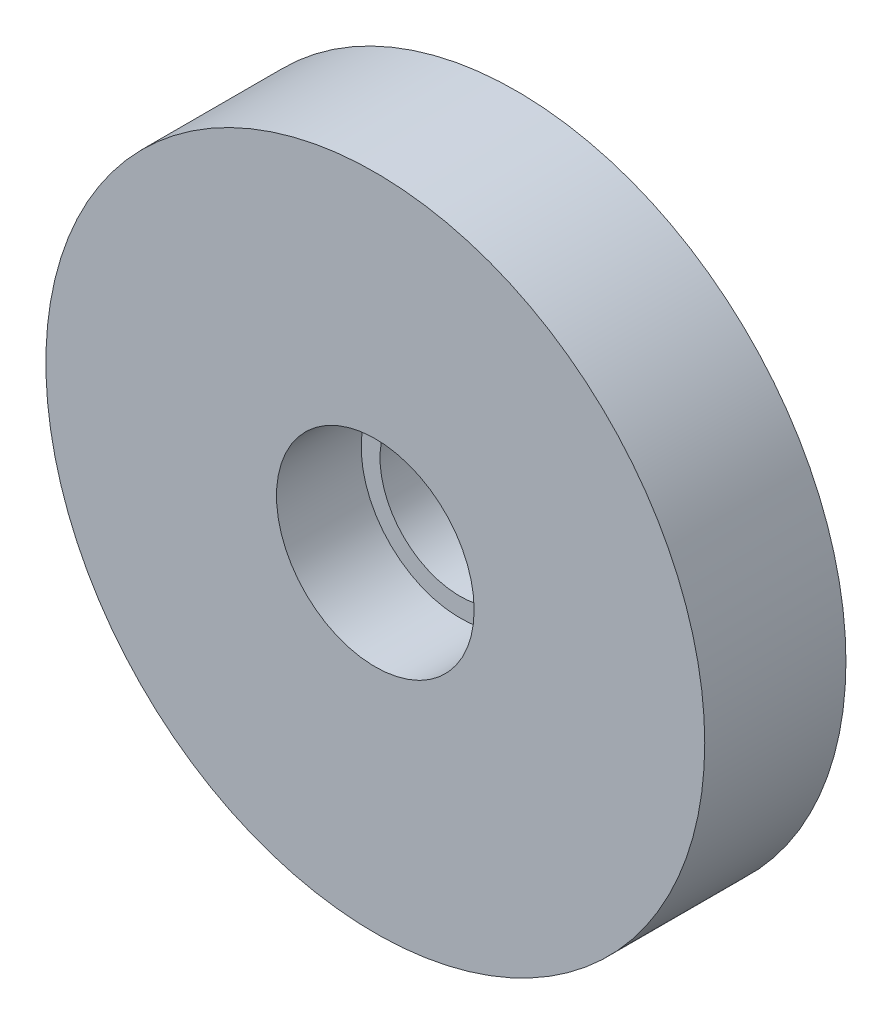
ISO-10303-21;
HEADER;
FILE_DESCRIPTION(('STEP AP214'),'2;1');
FILE_NAME('part.step','',(''),(''),'','','');
FILE_SCHEMA(('AUTOMOTIVE_DESIGN { 1 0 10303 214 1 1 1 1 }'));
ENDSEC;
DATA;
#1=APPLICATION_CONTEXT('core data for automotive mechanical design processes');
#2=APPLICATION_PROTOCOL_DEFINITION('international standard','automotive_design',2000,#1);
#3=PRODUCT_CONTEXT('',#1,'mechanical');
#4=PRODUCT('Part','Part','',(#3));
#5=PRODUCT_RELATED_PRODUCT_CATEGORY('part','',(#4));
#6=PRODUCT_DEFINITION_FORMATION('','',#4);
#7=PRODUCT_DEFINITION_CONTEXT('part definition',#1,'design');
#8=PRODUCT_DEFINITION('design','',#6,#7);
#9=PRODUCT_DEFINITION_SHAPE('','',#8);
#10=(LENGTH_UNIT() NAMED_UNIT(*) SI_UNIT(.MILLI.,.METRE.));
#11=(NAMED_UNIT(*) PLANE_ANGLE_UNIT() SI_UNIT($,.RADIAN.));
#12=(NAMED_UNIT(*) SI_UNIT($,.STERADIAN.) SOLID_ANGLE_UNIT());
#13=UNCERTAINTY_MEASURE_WITH_UNIT(LENGTH_MEASURE(1.E-05),#10,'distance_accuracy_value','');
#14=(GEOMETRIC_REPRESENTATION_CONTEXT(3) GLOBAL_UNCERTAINTY_ASSIGNED_CONTEXT((#13)) GLOBAL_UNIT_ASSIGNED_CONTEXT((#10,
#11,#12)) REPRESENTATION_CONTEXT('',''));
#15=CARTESIAN_POINT('',(0.,0.,0.));
#16=DIRECTION('',(0.,0.,1.));
#17=DIRECTION('',(1.,0.,0.));
#18=AXIS2_PLACEMENT_3D('',#15,#16,#17);
#19=CARTESIAN_POINT('',(0.,0.,15.));
#20=DIRECTION('',(0.,0.,-1.));
#21=DIRECTION('',(-1.,0.,0.));
#22=AXIS2_PLACEMENT_3D('',#19,#20,#21);
#23=CYLINDRICAL_SURFACE('',#22,8.5);
#24=CARTESIAN_POINT('',(0.,0.,0.));
#25=DIRECTION('',(0.,0.,1.));
#26=DIRECTION('',(1.,0.,0.));
#27=AXIS2_PLACEMENT_3D('',#24,#25,#26);
#28=CIRCLE('',#27,8.5);
#29=CARTESIAN_POINT('',(8.5,0.,0.));
#30=VERTEX_POINT('',#29);
#31=EDGE_CURVE('E52',#30,#30,#28,.T.);
#32=ORIENTED_EDGE('',*,*,#31,.F.);
#33=EDGE_LOOP('',(#32));
#34=FACE_BOUND('',#33,.T.);
#35=CARTESIAN_POINT('',(0.,0.,6.00000000000001));
#36=DIRECTION('',(0.,0.,1.));
#37=DIRECTION('',(1.,0.,0.));
#38=AXIS2_PLACEMENT_3D('',#35,#36,#37);
#39=CIRCLE('',#38,8.5);
#40=CARTESIAN_POINT('',(8.5,0.,6.00000000000001));
#41=VERTEX_POINT('',#40);
#42=EDGE_CURVE('E43',#41,#41,#39,.T.);
#43=ORIENTED_EDGE('',*,*,#42,.T.);
#44=EDGE_LOOP('',(#43));
#45=FACE_BOUND('',#44,.T.);
#46=ADVANCED_FACE('F39',(#34,#45),#23,.F.);
#47=CARTESIAN_POINT('',(0.,0.,15.));
#48=DIRECTION('',(0.,0.,1.));
#49=DIRECTION('',(1.,0.,0.));
#50=AXIS2_PLACEMENT_3D('',#47,#48,#49);
#51=PLANE('',#50);
#52=CARTESIAN_POINT('',(0.,0.,15.));
#53=DIRECTION('',(0.,0.,1.));
#54=DIRECTION('',(1.,0.,0.));
#55=AXIS2_PLACEMENT_3D('',#52,#53,#54);
#56=CIRCLE('',#55,10.5);
#57=CARTESIAN_POINT('',(10.5,0.,15.));
#58=VERTEX_POINT('',#57);
#59=EDGE_CURVE('E56',#58,#58,#56,.T.);
#60=ORIENTED_EDGE('',*,*,#59,.F.);
#61=EDGE_LOOP('',(#60));
#62=FACE_BOUND('',#61,.T.);
#63=CARTESIAN_POINT('',(0.,0.,15.));
#64=DIRECTION('',(0.,0.,1.));
#65=DIRECTION('',(1.,0.,0.));
#66=AXIS2_PLACEMENT_3D('',#63,#64,#65);
#67=CIRCLE('',#66,35.);
#68=CARTESIAN_POINT('',(35.,0.,15.));
#69=VERTEX_POINT('',#68);
#70=EDGE_CURVE('E10',#69,#69,#67,.T.);
#71=ORIENTED_EDGE('',*,*,#70,.T.);
#72=EDGE_LOOP('',(#71));
#73=FACE_BOUND('',#72,.T.);
#74=ADVANCED_FACE('F77',(#62,#73),#51,.T.);
#75=CARTESIAN_POINT('',(0.,0.,0.));
#76=DIRECTION('',(0.,0.,1.));
#77=DIRECTION('',(1.,0.,0.));
#78=AXIS2_PLACEMENT_3D('',#75,#76,#77);
#79=PLANE('',#78);
#80=CARTESIAN_POINT('',(0.,0.,0.));
#81=DIRECTION('',(0.,0.,1.));
#82=DIRECTION('',(1.,0.,0.));
#83=AXIS2_PLACEMENT_3D('',#80,#81,#82);
#84=CIRCLE('',#83,35.);
#85=CARTESIAN_POINT('',(35.,0.,0.));
#86=VERTEX_POINT('',#85);
#87=EDGE_CURVE('E47',#86,#86,#84,.T.);
#88=ORIENTED_EDGE('',*,*,#87,.F.);
#89=EDGE_LOOP('',(#88));
#90=FACE_BOUND('',#89,.T.);
#91=ORIENTED_EDGE('',*,*,#31,.T.);
#92=EDGE_LOOP('',(#91));
#93=FACE_BOUND('',#92,.T.);
#94=ADVANCED_FACE('F83',(#90,#93),#79,.F.);
#95=CARTESIAN_POINT('',(0.,0.,15.));
#96=DIRECTION('',(0.,0.,-1.));
#97=DIRECTION('',(-1.,0.,0.));
#98=AXIS2_PLACEMENT_3D('',#95,#96,#97);
#99=CYLINDRICAL_SURFACE('',#98,35.);
#100=ORIENTED_EDGE('',*,*,#70,.F.);
#101=EDGE_LOOP('',(#100));
#102=FACE_BOUND('',#101,.T.);
#103=ORIENTED_EDGE('',*,*,#87,.T.);
#104=EDGE_LOOP('',(#103));
#105=FACE_BOUND('',#104,.T.);
#106=ADVANCED_FACE('F41',(#102,#105),#99,.T.);
#107=CARTESIAN_POINT('',(0.,0.,6.00000000000001));
#108=DIRECTION('',(0.,0.,1.));
#109=DIRECTION('',(1.,0.,0.));
#110=AXIS2_PLACEMENT_3D('',#107,#108,#109);
#111=CYLINDRICAL_SURFACE('',#110,10.5);
#112=CARTESIAN_POINT('',(0.,0.,6.00000000000001));
#113=DIRECTION('',(0.,0.,1.));
#114=DIRECTION('',(1.,0.,0.));
#115=AXIS2_PLACEMENT_3D('',#112,#113,#114);
#116=CIRCLE('',#115,10.5);
#117=CARTESIAN_POINT('',(10.5,0.,6.00000000000001));
#118=VERTEX_POINT('',#117);
#119=EDGE_CURVE('E59',#118,#118,#116,.T.);
#120=ORIENTED_EDGE('',*,*,#119,.F.);
#121=EDGE_LOOP('',(#120));
#122=FACE_BOUND('',#121,.T.);
#123=ORIENTED_EDGE('',*,*,#59,.T.);
#124=EDGE_LOOP('',(#123));
#125=FACE_BOUND('',#124,.T.);
#126=ADVANCED_FACE('F69',(#122,#125),#111,.F.);
#127=CARTESIAN_POINT('',(0.,0.,6.00000000000001));
#128=DIRECTION('',(0.,0.,1.));
#129=DIRECTION('',(1.,0.,0.));
#130=AXIS2_PLACEMENT_3D('',#127,#128,#129);
#131=PLANE('',#130);
#132=ORIENTED_EDGE('',*,*,#42,.F.);
#133=EDGE_LOOP('',(#132));
#134=FACE_BOUND('',#133,.T.);
#135=ORIENTED_EDGE('',*,*,#119,.T.);
#136=EDGE_LOOP('',(#135));
#137=FACE_BOUND('',#136,.T.);
#138=ADVANCED_FACE('F67',(#134,#137),#131,.T.);
#139=CLOSED_SHELL('',(#46,#74,#94,#106,#126,#138));
#140=MANIFOLD_SOLID_BREP('B2',#139);
#141=ADVANCED_BREP_SHAPE_REPRESENTATION('',(#18,#140),#14);
#142=SHAPE_DEFINITION_REPRESENTATION(#9,#141);
ENDSEC;
END-ISO-10303-21;
